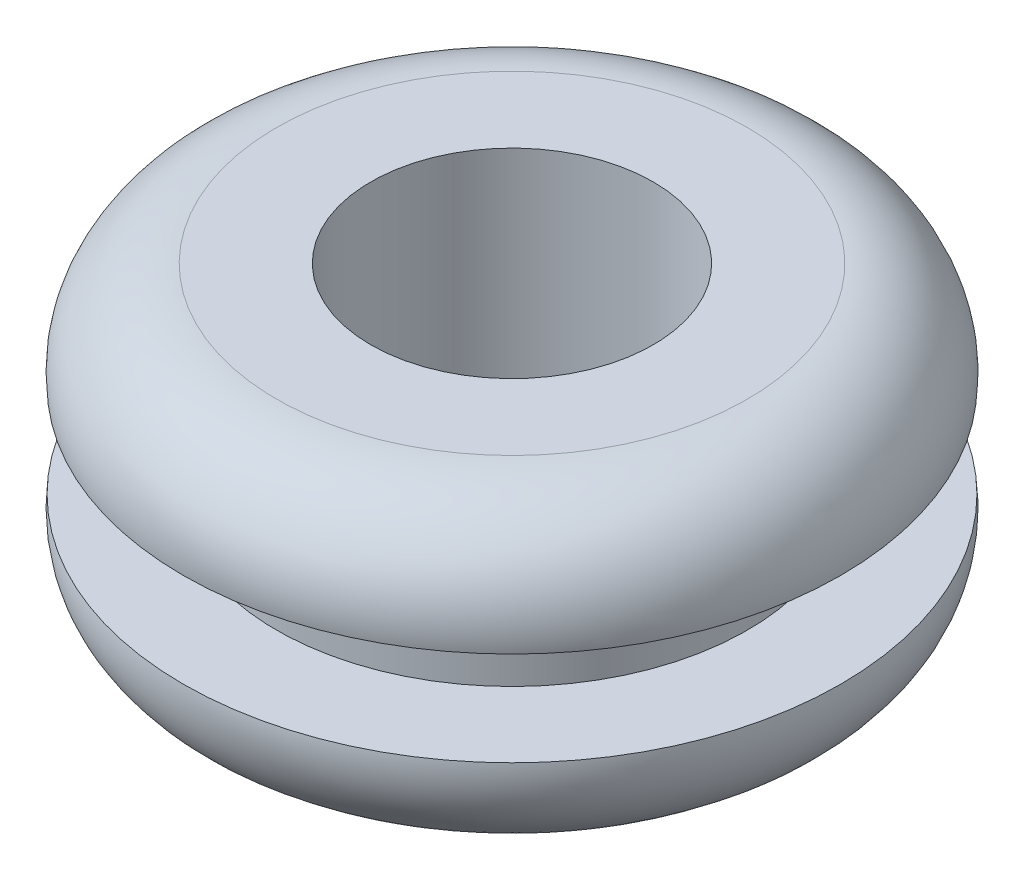
ISO-10303-21;
HEADER;
FILE_DESCRIPTION(('STEP AP214'),'2;1');
FILE_NAME('part.step','',(''),(''),'','','');
FILE_SCHEMA(('AUTOMOTIVE_DESIGN { 1 0 10303 214 1 1 1 1 }'));
ENDSEC;
DATA;
#1=APPLICATION_CONTEXT('core data for automotive mechanical design processes');
#2=APPLICATION_PROTOCOL_DEFINITION('international standard','automotive_design',2000,#1);
#3=PRODUCT_CONTEXT('',#1,'mechanical');
#4=PRODUCT('Part','Part','',(#3));
#5=PRODUCT_RELATED_PRODUCT_CATEGORY('part','',(#4));
#6=PRODUCT_DEFINITION_FORMATION('','',#4);
#7=PRODUCT_DEFINITION_CONTEXT('part definition',#1,'design');
#8=PRODUCT_DEFINITION('design','',#6,#7);
#9=PRODUCT_DEFINITION_SHAPE('','',#8);
#10=(LENGTH_UNIT() NAMED_UNIT(*) SI_UNIT(.MILLI.,.METRE.));
#11=(NAMED_UNIT(*) PLANE_ANGLE_UNIT() SI_UNIT($,.RADIAN.));
#12=(NAMED_UNIT(*) SI_UNIT($,.STERADIAN.) SOLID_ANGLE_UNIT());
#13=UNCERTAINTY_MEASURE_WITH_UNIT(LENGTH_MEASURE(1.E-05),#10,'distance_accuracy_value','');
#14=(GEOMETRIC_REPRESENTATION_CONTEXT(3) GLOBAL_UNCERTAINTY_ASSIGNED_CONTEXT((#13)) GLOBAL_UNIT_ASSIGNED_CONTEXT((#10,
#11,#12)) REPRESENTATION_CONTEXT('',''));
#15=CARTESIAN_POINT('',(0.,0.,0.));
#16=DIRECTION('',(0.,0.,1.));
#17=DIRECTION('',(1.,0.,0.));
#18=AXIS2_PLACEMENT_3D('',#15,#16,#17);
#19=CARTESIAN_POINT('',(0.,-5.159375,4.7625));
#20=DIRECTION('',(0.,1.,0.));
#21=DIRECTION('',(0.,0.,1.));
#22=AXIS2_PLACEMENT_3D('',#19,#20,#21);
#23=PLANE('',#22);
#24=CARTESIAN_POINT('',(0.,-5.159375,0.));
#25=DIRECTION('',(0.,-1.,0.));
#26=DIRECTION('',(0.,0.,-1.));
#27=AXIS2_PLACEMENT_3D('',#24,#25,#26);
#28=CIRCLE('',#27,4.7625);
#29=CARTESIAN_POINT('',(0.,-5.159375,-4.7625));
#30=VERTEX_POINT('',#29);
#31=EDGE_CURVE('E10',#30,#30,#28,.T.);
#32=ORIENTED_EDGE('',*,*,#31,.F.);
#33=EDGE_LOOP('',(#32));
#34=FACE_BOUND('',#33,.T.);
#35=CARTESIAN_POINT('',(0.,-5.159375,0.));
#36=DIRECTION('',(0.,-1.,0.));
#37=DIRECTION('',(0.,0.,-1.));
#38=AXIS2_PLACEMENT_3D('',#35,#36,#37);
#39=CIRCLE('',#38,7.9375);
#40=CARTESIAN_POINT('',(0.,-5.159375,-7.9375));
#41=VERTEX_POINT('',#40);
#42=EDGE_CURVE('E80',#41,#41,#39,.T.);
#43=ORIENTED_EDGE('',*,*,#42,.T.);
#44=EDGE_LOOP('',(#43));
#45=FACE_BOUND('',#44,.T.);
#46=ADVANCED_FACE('F43',(#34,#45),#23,.F.);
#47=CARTESIAN_POINT('',(0.,-5.159375,0.));
#48=DIRECTION('',(0.,-1.,0.));
#49=DIRECTION('',(0.,0.,-1.));
#50=AXIS2_PLACEMENT_3D('',#47,#48,#49);
#51=CYLINDRICAL_SURFACE('',#50,4.7625);
#52=CARTESIAN_POINT('',(0.,5.159375,0.));
#53=DIRECTION('',(0.,-1.,0.));
#54=DIRECTION('',(0.,0.,-1.));
#55=AXIS2_PLACEMENT_3D('',#52,#53,#54);
#56=CIRCLE('',#55,4.7625);
#57=CARTESIAN_POINT('',(0.,5.159375,-4.7625));
#58=VERTEX_POINT('',#57);
#59=EDGE_CURVE('E50',#58,#58,#56,.T.);
#60=ORIENTED_EDGE('',*,*,#59,.F.);
#61=EDGE_LOOP('',(#60));
#62=FACE_BOUND('',#61,.T.);
#63=ORIENTED_EDGE('',*,*,#31,.T.);
#64=EDGE_LOOP('',(#63));
#65=FACE_BOUND('',#64,.T.);
#66=ADVANCED_FACE('F119',(#62,#65),#51,.F.);
#67=CARTESIAN_POINT('',(0.,5.159375,4.7625));
#68=DIRECTION('',(0.,-1.,0.));
#69=DIRECTION('',(0.,0.,-1.));
#70=AXIS2_PLACEMENT_3D('',#67,#68,#69);
#71=PLANE('',#70);
#72=CARTESIAN_POINT('',(0.,5.159375,0.));
#73=DIRECTION('',(0.,-1.,0.));
#74=DIRECTION('',(0.,0.,-1.));
#75=AXIS2_PLACEMENT_3D('',#72,#73,#74);
#76=CIRCLE('',#75,7.9375);
#77=CARTESIAN_POINT('',(0.,5.159375,-7.9375));
#78=VERTEX_POINT('',#77);
#79=EDGE_CURVE('E56',#78,#78,#76,.T.);
#80=ORIENTED_EDGE('',*,*,#79,.F.);
#81=EDGE_LOOP('',(#80));
#82=FACE_BOUND('',#81,.T.);
#83=ORIENTED_EDGE('',*,*,#59,.T.);
#84=EDGE_LOOP('',(#83));
#85=FACE_BOUND('',#84,.T.);
#86=ADVANCED_FACE('F114',(#82,#85),#71,.F.);
#87=CARTESIAN_POINT('',(0.,1.984375,0.));
#88=DIRECTION('',(0.,-1.,0.));
#89=DIRECTION('',(0.,0.,-1.));
#90=AXIS2_PLACEMENT_3D('',#87,#88,#89);
#91=TOROIDAL_SURFACE('',#90,7.9375,3.175);
#92=CARTESIAN_POINT('',(0.,1.5875,0.));
#93=DIRECTION('',(0.,-1.,0.));
#94=DIRECTION('',(0.,0.,-1.));
#95=AXIS2_PLACEMENT_3D('',#92,#93,#94);
#96=CIRCLE('',#95,11.0875976547363);
#97=CARTESIAN_POINT('',(0.,1.5875,-11.0875976547363));
#98=VERTEX_POINT('',#97);
#99=EDGE_CURVE('E62',#98,#98,#96,.T.);
#100=ORIENTED_EDGE('',*,*,#99,.F.);
#101=EDGE_LOOP('',(#100));
#102=FACE_BOUND('',#101,.T.);
#103=ORIENTED_EDGE('',*,*,#79,.T.);
#104=EDGE_LOOP('',(#103));
#105=FACE_BOUND('',#104,.T.);
#106=ADVANCED_FACE('F108',(#102,#105),#91,.T.);
#107=CARTESIAN_POINT('',(0.,1.5875,7.9375));
#108=DIRECTION('',(0.,1.,0.));
#109=DIRECTION('',(0.,0.,1.));
#110=AXIS2_PLACEMENT_3D('',#107,#108,#109);
#111=PLANE('',#110);
#112=CARTESIAN_POINT('',(0.,1.5875,0.));
#113=DIRECTION('',(0.,-1.,0.));
#114=DIRECTION('',(0.,0.,-1.));
#115=AXIS2_PLACEMENT_3D('',#112,#113,#114);
#116=CIRCLE('',#115,7.9375);
#117=CARTESIAN_POINT('',(0.,1.5875,-7.9375));
#118=VERTEX_POINT('',#117);
#119=EDGE_CURVE('E68',#118,#118,#116,.T.);
#120=ORIENTED_EDGE('',*,*,#119,.F.);
#121=EDGE_LOOP('',(#120));
#122=FACE_BOUND('',#121,.T.);
#123=ORIENTED_EDGE('',*,*,#99,.T.);
#124=EDGE_LOOP('',(#123));
#125=FACE_BOUND('',#124,.T.);
#126=ADVANCED_FACE('F102',(#122,#125),#111,.F.);
#127=CARTESIAN_POINT('',(0.,-5.159375,0.));
#128=DIRECTION('',(0.,-1.,0.));
#129=DIRECTION('',(0.,0.,-1.));
#130=AXIS2_PLACEMENT_3D('',#127,#128,#129);
#131=CYLINDRICAL_SURFACE('',#130,7.9375);
#132=CARTESIAN_POINT('',(0.,-1.5875,0.));
#133=DIRECTION('',(0.,-1.,0.));
#134=DIRECTION('',(0.,0.,-1.));
#135=AXIS2_PLACEMENT_3D('',#132,#133,#134);
#136=CIRCLE('',#135,7.9375);
#137=CARTESIAN_POINT('',(0.,-1.5875,-7.9375));
#138=VERTEX_POINT('',#137);
#139=EDGE_CURVE('E72',#138,#138,#136,.T.);
#140=ORIENTED_EDGE('',*,*,#139,.F.);
#141=EDGE_LOOP('',(#140));
#142=FACE_BOUND('',#141,.T.);
#143=ORIENTED_EDGE('',*,*,#119,.T.);
#144=EDGE_LOOP('',(#143));
#145=FACE_BOUND('',#144,.T.);
#146=ADVANCED_FACE('F96',(#142,#145),#131,.T.);
#147=CARTESIAN_POINT('',(0.,-1.5875,7.9375));
#148=DIRECTION('',(0.,-1.,0.));
#149=DIRECTION('',(0.,0.,-1.));
#150=AXIS2_PLACEMENT_3D('',#147,#148,#149);
#151=PLANE('',#150);
#152=CARTESIAN_POINT('',(0.,-1.5875,0.));
#153=DIRECTION('',(0.,-1.,0.));
#154=DIRECTION('',(0.,0.,-1.));
#155=AXIS2_PLACEMENT_3D('',#152,#153,#154);
#156=CIRCLE('',#155,11.0875976547363);
#157=CARTESIAN_POINT('',(0.,-1.5875,-11.0875976547363));
#158=VERTEX_POINT('',#157);
#159=EDGE_CURVE('E76',#158,#158,#156,.T.);
#160=ORIENTED_EDGE('',*,*,#159,.F.);
#161=EDGE_LOOP('',(#160));
#162=FACE_BOUND('',#161,.T.);
#163=ORIENTED_EDGE('',*,*,#139,.T.);
#164=EDGE_LOOP('',(#163));
#165=FACE_BOUND('',#164,.T.);
#166=ADVANCED_FACE('F90',(#162,#165),#151,.F.);
#167=CARTESIAN_POINT('',(0.,-1.984375,0.));
#168=DIRECTION('',(0.,-1.,0.));
#169=DIRECTION('',(0.,0.,-1.));
#170=AXIS2_PLACEMENT_3D('',#167,#168,#169);
#171=TOROIDAL_SURFACE('',#170,7.9375,3.175);
#172=ORIENTED_EDGE('',*,*,#42,.F.);
#173=EDGE_LOOP('',(#172));
#174=FACE_BOUND('',#173,.T.);
#175=ORIENTED_EDGE('',*,*,#159,.T.);
#176=EDGE_LOOP('',(#175));
#177=FACE_BOUND('',#176,.T.);
#178=ADVANCED_FACE('F87',(#174,#177),#171,.T.);
#179=CLOSED_SHELL('',(#46,#66,#86,#106,#126,#146,#166,#178));
#180=MANIFOLD_SOLID_BREP('B2',#179);
#181=ADVANCED_BREP_SHAPE_REPRESENTATION('',(#18,#180),#14);
#182=SHAPE_DEFINITION_REPRESENTATION(#9,#181);
ENDSEC;
END-ISO-10303-21;
